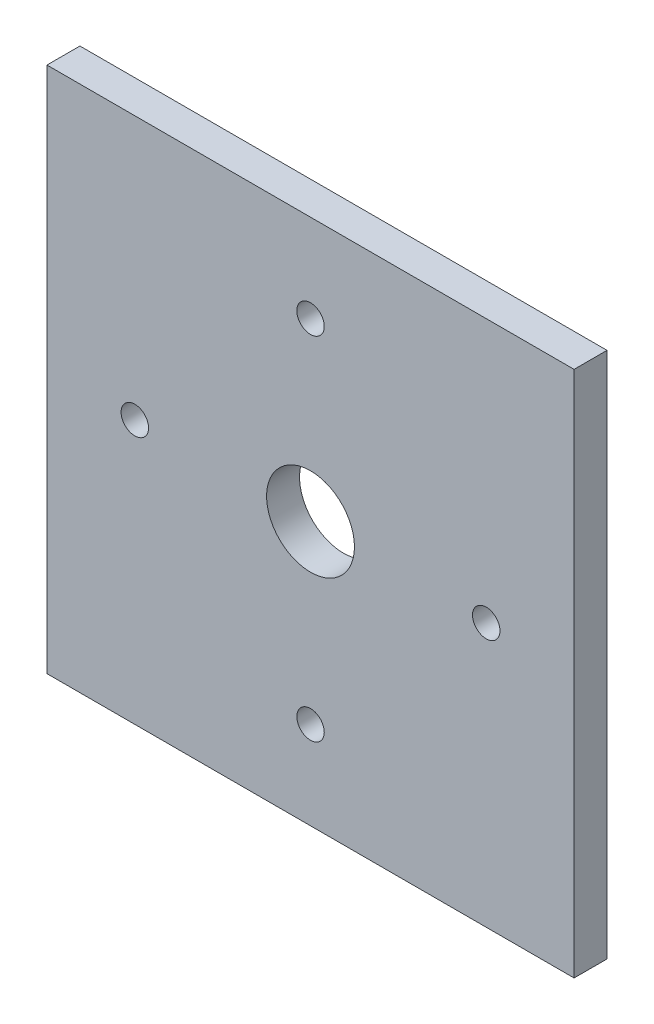
ISO-10303-21;
HEADER;
FILE_DESCRIPTION(('STEP AP214'),'2;1');
FILE_NAME('part.step','',(''),(''),'','','');
FILE_SCHEMA(('AUTOMOTIVE_DESIGN { 1 0 10303 214 1 1 1 1 }'));
ENDSEC;
DATA;
#1=APPLICATION_CONTEXT('core data for automotive mechanical design processes');
#2=APPLICATION_PROTOCOL_DEFINITION('international standard','automotive_design',2000,#1);
#3=PRODUCT_CONTEXT('',#1,'mechanical');
#4=PRODUCT('Part','Part','',(#3));
#5=PRODUCT_RELATED_PRODUCT_CATEGORY('part','',(#4));
#6=PRODUCT_DEFINITION_FORMATION('','',#4);
#7=PRODUCT_DEFINITION_CONTEXT('part definition',#1,'design');
#8=PRODUCT_DEFINITION('design','',#6,#7);
#9=PRODUCT_DEFINITION_SHAPE('','',#8);
#10=(LENGTH_UNIT() NAMED_UNIT(*) SI_UNIT(.MILLI.,.METRE.));
#11=(NAMED_UNIT(*) PLANE_ANGLE_UNIT() SI_UNIT($,.RADIAN.));
#12=(NAMED_UNIT(*) SI_UNIT($,.STERADIAN.) SOLID_ANGLE_UNIT());
#13=UNCERTAINTY_MEASURE_WITH_UNIT(LENGTH_MEASURE(1.E-05),#10,'distance_accuracy_value','');
#14=(GEOMETRIC_REPRESENTATION_CONTEXT(3) GLOBAL_UNCERTAINTY_ASSIGNED_CONTEXT((#13)) GLOBAL_UNIT_ASSIGNED_CONTEXT((#10,
#11,#12)) REPRESENTATION_CONTEXT('',''));
#15=CARTESIAN_POINT('',(0.,0.,0.));
#16=DIRECTION('',(0.,0.,1.));
#17=DIRECTION('',(1.,0.,0.));
#18=AXIS2_PLACEMENT_3D('',#15,#16,#17);
#19=CARTESIAN_POINT('',(0.,0.,9.525));
#20=DIRECTION('',(1.,0.,0.));
#21=DIRECTION('',(0.,0.,-1.));
#22=AXIS2_PLACEMENT_3D('',#19,#20,#21);
#23=PLANE('',#22);
#24=DIRECTION('',(0.,-1.,0.));
#25=VECTOR('',#24,1.);
#26=CARTESIAN_POINT('',(0.,0.,0.));
#27=LINE('',#26,#25);
#28=CARTESIAN_POINT('',(0.,152.4,0.));
#29=VERTEX_POINT('',#28);
#30=CARTESIAN_POINT('',(0.,0.,0.));
#31=VERTEX_POINT('',#30);
#32=EDGE_CURVE('E105',#29,#31,#27,.T.);
#33=ORIENTED_EDGE('',*,*,#32,.T.);
#34=DIRECTION('',(0.,0.,-1.));
#35=VECTOR('',#34,1.);
#36=CARTESIAN_POINT('',(0.,0.,9.525));
#37=LINE('',#36,#35);
#38=CARTESIAN_POINT('',(0.,0.,9.525));
#39=VERTEX_POINT('',#38);
#40=EDGE_CURVE('E11',#39,#31,#37,.T.);
#41=ORIENTED_EDGE('',*,*,#40,.F.);
#42=DIRECTION('',(0.,-1.,0.));
#43=VECTOR('',#42,1.);
#44=CARTESIAN_POINT('',(0.,0.,9.525));
#45=LINE('',#44,#43);
#46=CARTESIAN_POINT('',(0.,152.4,9.525));
#47=VERTEX_POINT('',#46);
#48=EDGE_CURVE('E89',#47,#39,#45,.T.);
#49=ORIENTED_EDGE('',*,*,#48,.F.);
#50=DIRECTION('',(0.,0.,-1.));
#51=VECTOR('',#50,1.);
#52=CARTESIAN_POINT('',(0.,152.4,9.525));
#53=LINE('',#52,#51);
#54=EDGE_CURVE('E98',#47,#29,#53,.T.);
#55=ORIENTED_EDGE('',*,*,#54,.T.);
#56=EDGE_LOOP('',(#33,#41,#49,#55));
#57=FACE_BOUND('',#56,.T.);
#58=ADVANCED_FACE('F39',(#57),#23,.F.);
#59=CARTESIAN_POINT('',(0.,0.,9.525));
#60=DIRECTION('',(0.,1.,0.));
#61=DIRECTION('',(0.,0.,1.));
#62=AXIS2_PLACEMENT_3D('',#59,#60,#61);
#63=PLANE('',#62);
#64=DIRECTION('',(1.,0.,0.));
#65=VECTOR('',#64,1.);
#66=CARTESIAN_POINT('',(0.,0.,0.));
#67=LINE('',#66,#65);
#68=CARTESIAN_POINT('',(152.4,0.,0.));
#69=VERTEX_POINT('',#68);
#70=EDGE_CURVE('E94',#31,#69,#67,.T.);
#71=ORIENTED_EDGE('',*,*,#70,.T.);
#72=DIRECTION('',(0.,0.,-1.));
#73=VECTOR('',#72,1.);
#74=CARTESIAN_POINT('',(152.4,0.,9.525));
#75=LINE('',#74,#73);
#76=CARTESIAN_POINT('',(152.4,0.,9.525));
#77=VERTEX_POINT('',#76);
#78=EDGE_CURVE('E50',#77,#69,#75,.T.);
#79=ORIENTED_EDGE('',*,*,#78,.F.);
#80=DIRECTION('',(1.,0.,0.));
#81=VECTOR('',#80,1.);
#82=CARTESIAN_POINT('',(0.,0.,9.525));
#83=LINE('',#82,#81);
#84=EDGE_CURVE('E81',#39,#77,#83,.T.);
#85=ORIENTED_EDGE('',*,*,#84,.F.);
#86=ORIENTED_EDGE('',*,*,#40,.T.);
#87=EDGE_LOOP('',(#71,#79,#85,#86));
#88=FACE_BOUND('',#87,.T.);
#89=ADVANCED_FACE('F91',(#88),#63,.F.);
#90=CARTESIAN_POINT('',(152.4,0.,9.525));
#91=DIRECTION('',(-1.,0.,0.));
#92=DIRECTION('',(0.,0.,1.));
#93=AXIS2_PLACEMENT_3D('',#90,#91,#92);
#94=PLANE('',#93);
#95=DIRECTION('',(0.,1.,0.));
#96=VECTOR('',#95,1.);
#97=CARTESIAN_POINT('',(152.4,0.,0.));
#98=LINE('',#97,#96);
#99=CARTESIAN_POINT('',(152.4,152.4,0.));
#100=VERTEX_POINT('',#99);
#101=EDGE_CURVE('E75',#69,#100,#98,.T.);
#102=ORIENTED_EDGE('',*,*,#101,.T.);
#103=DIRECTION('',(0.,0.,-1.));
#104=VECTOR('',#103,1.);
#105=CARTESIAN_POINT('',(152.4,152.4,9.525));
#106=LINE('',#105,#104);
#107=CARTESIAN_POINT('',(152.4,152.4,9.525));
#108=VERTEX_POINT('',#107);
#109=EDGE_CURVE('E92',#108,#100,#106,.T.);
#110=ORIENTED_EDGE('',*,*,#109,.F.);
#111=DIRECTION('',(0.,1.,0.));
#112=VECTOR('',#111,1.);
#113=CARTESIAN_POINT('',(152.4,0.,9.525));
#114=LINE('',#113,#112);
#115=EDGE_CURVE('E86',#77,#108,#114,.T.);
#116=ORIENTED_EDGE('',*,*,#115,.F.);
#117=ORIENTED_EDGE('',*,*,#78,.T.);
#118=EDGE_LOOP('',(#102,#110,#116,#117));
#119=FACE_BOUND('',#118,.T.);
#120=ADVANCED_FACE('F96',(#119),#94,.F.);
#121=CARTESIAN_POINT('',(0.,152.4,9.525));
#122=DIRECTION('',(0.,-1.,0.));
#123=DIRECTION('',(0.,0.,-1.));
#124=AXIS2_PLACEMENT_3D('',#121,#122,#123);
#125=PLANE('',#124);
#126=DIRECTION('',(-1.,0.,0.));
#127=VECTOR('',#126,1.);
#128=CARTESIAN_POINT('',(0.,152.4,0.));
#129=LINE('',#128,#127);
#130=EDGE_CURVE('E79',#100,#29,#129,.T.);
#131=ORIENTED_EDGE('',*,*,#130,.T.);
#132=ORIENTED_EDGE('',*,*,#54,.F.);
#133=DIRECTION('',(-1.,0.,0.));
#134=VECTOR('',#133,1.);
#135=CARTESIAN_POINT('',(0.,152.4,9.525));
#136=LINE('',#135,#134);
#137=EDGE_CURVE('E54',#108,#47,#136,.T.);
#138=ORIENTED_EDGE('',*,*,#137,.F.);
#139=ORIENTED_EDGE('',*,*,#109,.T.);
#140=EDGE_LOOP('',(#131,#132,#138,#139));
#141=FACE_BOUND('',#140,.T.);
#142=ADVANCED_FACE('F109',(#141),#125,.F.);
#143=CARTESIAN_POINT('',(0.,0.,9.525));
#144=DIRECTION('',(0.,0.,-1.));
#145=DIRECTION('',(-1.,0.,0.));
#146=AXIS2_PLACEMENT_3D('',#143,#144,#145);
#147=PLANE('',#146);
#148=CARTESIAN_POINT('',(76.2,76.2,9.525));
#149=DIRECTION('',(0.,0.,1.));
#150=DIRECTION('',(1.,0.,0.));
#151=AXIS2_PLACEMENT_3D('',#148,#149,#150);
#152=CIRCLE('',#151,12.7);
#153=CARTESIAN_POINT('',(88.9,76.2,9.525));
#154=VERTEX_POINT('',#153);
#155=EDGE_CURVE('E117',#154,#154,#152,.T.);
#156=ORIENTED_EDGE('',*,*,#155,.F.);
#157=EDGE_LOOP('',(#156));
#158=FACE_BOUND('',#157,.T.);
#159=CARTESIAN_POINT('',(127.,76.2,9.525));
#160=DIRECTION('',(0.,0.,1.));
#161=DIRECTION('',(1.,0.,0.));
#162=AXIS2_PLACEMENT_3D('',#159,#160,#161);
#163=CIRCLE('',#162,3.96874999999999);
#164=CARTESIAN_POINT('',(130.96875,76.2,9.525));
#165=VERTEX_POINT('',#164);
#166=EDGE_CURVE('E104',#165,#165,#163,.T.);
#167=ORIENTED_EDGE('',*,*,#166,.F.);
#168=EDGE_LOOP('',(#167));
#169=FACE_BOUND('',#168,.T.);
#170=CARTESIAN_POINT('',(76.2,127.,9.525));
#171=DIRECTION('',(0.,0.,1.));
#172=DIRECTION('',(1.,0.,0.));
#173=AXIS2_PLACEMENT_3D('',#170,#171,#172);
#174=CIRCLE('',#173,3.96874999999999);
#175=CARTESIAN_POINT('',(80.16875,127.,9.525));
#176=VERTEX_POINT('',#175);
#177=EDGE_CURVE('E129',#176,#176,#174,.T.);
#178=ORIENTED_EDGE('',*,*,#177,.F.);
#179=EDGE_LOOP('',(#178));
#180=FACE_BOUND('',#179,.T.);
#181=CARTESIAN_POINT('',(25.4,76.2,9.525));
#182=DIRECTION('',(0.,0.,1.));
#183=DIRECTION('',(1.,0.,0.));
#184=AXIS2_PLACEMENT_3D('',#181,#182,#183);
#185=CIRCLE('',#184,3.96875);
#186=CARTESIAN_POINT('',(29.36875,76.2,9.525));
#187=VERTEX_POINT('',#186);
#188=EDGE_CURVE('E122',#187,#187,#185,.T.);
#189=ORIENTED_EDGE('',*,*,#188,.F.);
#190=EDGE_LOOP('',(#189));
#191=FACE_BOUND('',#190,.T.);
#192=CARTESIAN_POINT('',(76.2,25.4,9.525));
#193=DIRECTION('',(0.,0.,1.));
#194=DIRECTION('',(1.,0.,0.));
#195=AXIS2_PLACEMENT_3D('',#192,#193,#194);
#196=CIRCLE('',#195,3.96874999999999);
#197=CARTESIAN_POINT('',(80.16875,25.4,9.525));
#198=VERTEX_POINT('',#197);
#199=EDGE_CURVE('E119',#198,#198,#196,.T.);
#200=ORIENTED_EDGE('',*,*,#199,.F.);
#201=EDGE_LOOP('',(#200));
#202=FACE_BOUND('',#201,.T.);
#203=ORIENTED_EDGE('',*,*,#48,.T.);
#204=ORIENTED_EDGE('',*,*,#84,.T.);
#205=ORIENTED_EDGE('',*,*,#115,.T.);
#206=ORIENTED_EDGE('',*,*,#137,.T.);
#207=EDGE_LOOP('',(#203,#204,#205,#206));
#208=FACE_BOUND('',#207,.T.);
#209=ADVANCED_FACE('F88',(#158,#169,#180,#191,#202,#208),#147,.F.);
#210=CARTESIAN_POINT('',(0.,0.,0.));
#211=DIRECTION('',(0.,0.,-1.));
#212=DIRECTION('',(-1.,0.,0.));
#213=AXIS2_PLACEMENT_3D('',#210,#211,#212);
#214=PLANE('',#213);
#215=CARTESIAN_POINT('',(76.2,76.2,0.));
#216=DIRECTION('',(0.,0.,1.));
#217=DIRECTION('',(1.,0.,0.));
#218=AXIS2_PLACEMENT_3D('',#215,#216,#217);
#219=CIRCLE('',#218,12.7);
#220=CARTESIAN_POINT('',(88.9,76.2,0.));
#221=VERTEX_POINT('',#220);
#222=EDGE_CURVE('E136',#221,#221,#219,.T.);
#223=ORIENTED_EDGE('',*,*,#222,.T.);
#224=EDGE_LOOP('',(#223));
#225=FACE_BOUND('',#224,.T.);
#226=CARTESIAN_POINT('',(127.,76.2,0.));
#227=DIRECTION('',(0.,0.,1.));
#228=DIRECTION('',(1.,0.,0.));
#229=AXIS2_PLACEMENT_3D('',#226,#227,#228);
#230=CIRCLE('',#229,3.96874999999999);
#231=CARTESIAN_POINT('',(130.96875,76.2,0.));
#232=VERTEX_POINT('',#231);
#233=EDGE_CURVE('E133',#232,#232,#230,.T.);
#234=ORIENTED_EDGE('',*,*,#233,.T.);
#235=EDGE_LOOP('',(#234));
#236=FACE_BOUND('',#235,.T.);
#237=CARTESIAN_POINT('',(76.2,127.,0.));
#238=DIRECTION('',(0.,0.,1.));
#239=DIRECTION('',(1.,0.,0.));
#240=AXIS2_PLACEMENT_3D('',#237,#238,#239);
#241=CIRCLE('',#240,3.96874999999999);
#242=CARTESIAN_POINT('',(80.16875,127.,0.));
#243=VERTEX_POINT('',#242);
#244=EDGE_CURVE('E135',#243,#243,#241,.T.);
#245=ORIENTED_EDGE('',*,*,#244,.T.);
#246=EDGE_LOOP('',(#245));
#247=FACE_BOUND('',#246,.T.);
#248=CARTESIAN_POINT('',(25.4,76.2,0.));
#249=DIRECTION('',(0.,0.,1.));
#250=DIRECTION('',(1.,0.,0.));
#251=AXIS2_PLACEMENT_3D('',#248,#249,#250);
#252=CIRCLE('',#251,3.96875);
#253=CARTESIAN_POINT('',(29.36875,76.2,0.));
#254=VERTEX_POINT('',#253);
#255=EDGE_CURVE('E127',#254,#254,#252,.T.);
#256=ORIENTED_EDGE('',*,*,#255,.T.);
#257=EDGE_LOOP('',(#256));
#258=FACE_BOUND('',#257,.T.);
#259=CARTESIAN_POINT('',(76.2,25.4,0.));
#260=DIRECTION('',(0.,0.,1.));
#261=DIRECTION('',(1.,0.,0.));
#262=AXIS2_PLACEMENT_3D('',#259,#260,#261);
#263=CIRCLE('',#262,3.96874999999999);
#264=CARTESIAN_POINT('',(80.16875,25.4,0.));
#265=VERTEX_POINT('',#264);
#266=EDGE_CURVE('E118',#265,#265,#263,.T.);
#267=ORIENTED_EDGE('',*,*,#266,.T.);
#268=EDGE_LOOP('',(#267));
#269=FACE_BOUND('',#268,.T.);
#270=ORIENTED_EDGE('',*,*,#32,.F.);
#271=ORIENTED_EDGE('',*,*,#130,.F.);
#272=ORIENTED_EDGE('',*,*,#101,.F.);
#273=ORIENTED_EDGE('',*,*,#70,.F.);
#274=EDGE_LOOP('',(#270,#271,#272,#273));
#275=FACE_BOUND('',#274,.T.);
#276=ADVANCED_FACE('F114',(#225,#236,#247,#258,#269,#275),#214,.T.);
#277=CARTESIAN_POINT('',(76.2,25.4,9.525));
#278=DIRECTION('',(0.,0.,-1.));
#279=DIRECTION('',(-1.,0.,0.));
#280=AXIS2_PLACEMENT_3D('',#277,#278,#279);
#281=CYLINDRICAL_SURFACE('',#280,3.96874999999999);
#282=ORIENTED_EDGE('',*,*,#199,.T.);
#283=EDGE_LOOP('',(#282));
#284=FACE_BOUND('',#283,.T.);
#285=ORIENTED_EDGE('',*,*,#266,.F.);
#286=EDGE_LOOP('',(#285));
#287=FACE_BOUND('',#286,.T.);
#288=ADVANCED_FACE('F159',(#284,#287),#281,.F.);
#289=CARTESIAN_POINT('',(25.4,76.2,9.525));
#290=DIRECTION('',(0.,0.,-1.));
#291=DIRECTION('',(-1.,0.,0.));
#292=AXIS2_PLACEMENT_3D('',#289,#290,#291);
#293=CYLINDRICAL_SURFACE('',#292,3.96875);
#294=ORIENTED_EDGE('',*,*,#188,.T.);
#295=EDGE_LOOP('',(#294));
#296=FACE_BOUND('',#295,.T.);
#297=ORIENTED_EDGE('',*,*,#255,.F.);
#298=EDGE_LOOP('',(#297));
#299=FACE_BOUND('',#298,.T.);
#300=ADVANCED_FACE('F162',(#296,#299),#293,.F.);
#301=CARTESIAN_POINT('',(76.2,127.,9.525));
#302=DIRECTION('',(0.,0.,-1.));
#303=DIRECTION('',(-1.,0.,0.));
#304=AXIS2_PLACEMENT_3D('',#301,#302,#303);
#305=CYLINDRICAL_SURFACE('',#304,3.96874999999999);
#306=ORIENTED_EDGE('',*,*,#177,.T.);
#307=EDGE_LOOP('',(#306));
#308=FACE_BOUND('',#307,.T.);
#309=ORIENTED_EDGE('',*,*,#244,.F.);
#310=EDGE_LOOP('',(#309));
#311=FACE_BOUND('',#310,.T.);
#312=ADVANCED_FACE('F203',(#308,#311),#305,.F.);
#313=CARTESIAN_POINT('',(127.,76.2,9.525));
#314=DIRECTION('',(0.,0.,-1.));
#315=DIRECTION('',(-1.,0.,0.));
#316=AXIS2_PLACEMENT_3D('',#313,#314,#315);
#317=CYLINDRICAL_SURFACE('',#316,3.96874999999999);
#318=ORIENTED_EDGE('',*,*,#166,.T.);
#319=EDGE_LOOP('',(#318));
#320=FACE_BOUND('',#319,.T.);
#321=ORIENTED_EDGE('',*,*,#233,.F.);
#322=EDGE_LOOP('',(#321));
#323=FACE_BOUND('',#322,.T.);
#324=ADVANCED_FACE('F209',(#320,#323),#317,.F.);
#325=CARTESIAN_POINT('',(76.2,76.2,9.525));
#326=DIRECTION('',(0.,0.,-1.));
#327=DIRECTION('',(-1.,0.,0.));
#328=AXIS2_PLACEMENT_3D('',#325,#326,#327);
#329=CYLINDRICAL_SURFACE('',#328,12.7);
#330=ORIENTED_EDGE('',*,*,#155,.T.);
#331=EDGE_LOOP('',(#330));
#332=FACE_BOUND('',#331,.T.);
#333=ORIENTED_EDGE('',*,*,#222,.F.);
#334=EDGE_LOOP('',(#333));
#335=FACE_BOUND('',#334,.T.);
#336=ADVANCED_FACE('F148',(#332,#335),#329,.F.);
#337=CLOSED_SHELL('',(#58,#89,#120,#142,#209,#276,#288,#300,#312,#324,#336));
#338=MANIFOLD_SOLID_BREP('B2',#337);
#339=ADVANCED_BREP_SHAPE_REPRESENTATION('',(#18,#338),#14);
#340=SHAPE_DEFINITION_REPRESENTATION(#9,#339);
ENDSEC;
END-ISO-10303-21;
